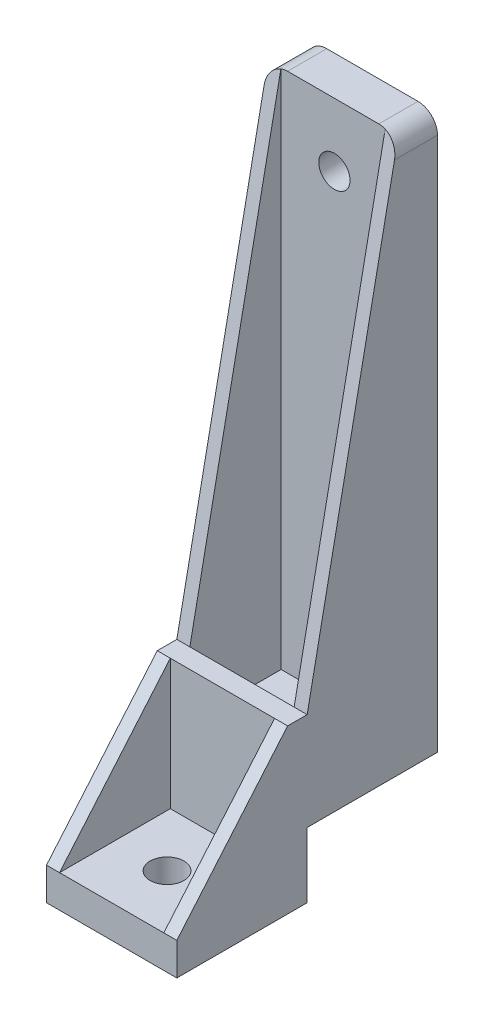
ISO-10303-21;
HEADER;
FILE_DESCRIPTION(('STEP AP214'),'2;1');
FILE_NAME('part.step','',(''),(''),'','','');
FILE_SCHEMA(('AUTOMOTIVE_DESIGN { 1 0 10303 214 1 1 1 1 }'));
ENDSEC;
DATA;
#1=APPLICATION_CONTEXT('core data for automotive mechanical design processes');
#2=APPLICATION_PROTOCOL_DEFINITION('international standard','automotive_design',2000,#1);
#3=PRODUCT_CONTEXT('',#1,'mechanical');
#4=PRODUCT('Part','Part','',(#3));
#5=PRODUCT_RELATED_PRODUCT_CATEGORY('part','',(#4));
#6=PRODUCT_DEFINITION_FORMATION('','',#4);
#7=PRODUCT_DEFINITION_CONTEXT('part definition',#1,'design');
#8=PRODUCT_DEFINITION('design','',#6,#7);
#9=PRODUCT_DEFINITION_SHAPE('','',#8);
#10=(LENGTH_UNIT() NAMED_UNIT(*) SI_UNIT(.MILLI.,.METRE.));
#11=(NAMED_UNIT(*) PLANE_ANGLE_UNIT() SI_UNIT($,.RADIAN.));
#12=(NAMED_UNIT(*) SI_UNIT($,.STERADIAN.) SOLID_ANGLE_UNIT());
#13=UNCERTAINTY_MEASURE_WITH_UNIT(LENGTH_MEASURE(1.E-05),#10,'distance_accuracy_value','');
#14=(GEOMETRIC_REPRESENTATION_CONTEXT(3) GLOBAL_UNCERTAINTY_ASSIGNED_CONTEXT((#13)) GLOBAL_UNIT_ASSIGNED_CONTEXT((#10,
#11,#12)) REPRESENTATION_CONTEXT('',''));
#15=CARTESIAN_POINT('',(0.,0.,0.));
#16=DIRECTION('',(0.,0.,1.));
#17=DIRECTION('',(1.,0.,0.));
#18=AXIS2_PLACEMENT_3D('',#15,#16,#17);
#19=CARTESIAN_POINT('',(10.,15.,-30.));
#20=DIRECTION('',(0.,-1.,0.));
#21=DIRECTION('',(0.,0.,-1.));
#22=AXIS2_PLACEMENT_3D('',#19,#20,#21);
#23=PLANE('',#22);
#24=DIRECTION('',(1.,0.,0.));
#25=VECTOR('',#24,1.);
#26=CARTESIAN_POINT('',(10.,15.,-10.));
#27=LINE('',#26,#25);
#28=CARTESIAN_POINT('',(-8.,15.,-10.));
#29=VERTEX_POINT('',#28);
#30=CARTESIAN_POINT('',(8.00000000000001,15.,-10.));
#31=VERTEX_POINT('',#30);
#32=EDGE_CURVE('E250',#29,#31,#27,.T.);
#33=ORIENTED_EDGE('',*,*,#32,.T.);
#34=DIRECTION('',(0.,0.,-1.));
#35=VECTOR('',#34,1.);
#36=CARTESIAN_POINT('',(8.00000000000001,15.,-10.));
#37=LINE('',#36,#35);
#38=CARTESIAN_POINT('',(8.00000000000001,15.,-24.));
#39=VERTEX_POINT('',#38);
#40=EDGE_CURVE('E232',#31,#39,#37,.T.);
#41=ORIENTED_EDGE('',*,*,#40,.T.);
#42=DIRECTION('',(1.,0.,0.));
#43=VECTOR('',#42,1.);
#44=CARTESIAN_POINT('',(-10.,15.,-24.));
#45=LINE('',#44,#43);
#46=CARTESIAN_POINT('',(-8.00000000000001,15.,-24.));
#47=VERTEX_POINT('',#46);
#48=EDGE_CURVE('E526',#47,#39,#45,.T.);
#49=ORIENTED_EDGE('',*,*,#48,.F.);
#50=DIRECTION('',(0.,0.,1.));
#51=VECTOR('',#50,1.);
#52=CARTESIAN_POINT('',(-8.,15.,-10.));
#53=LINE('',#52,#51);
#54=EDGE_CURVE('E258',#47,#29,#53,.T.);
#55=ORIENTED_EDGE('',*,*,#54,.T.);
#56=EDGE_LOOP('',(#33,#41,#49,#55));
#57=FACE_BOUND('',#56,.T.);
#58=ADVANCED_FACE('F53',(#57),#23,.F.);
#59=CARTESIAN_POINT('',(-10.,5.,-10.));
#60=DIRECTION('',(0.,0.,1.));
#61=DIRECTION('',(1.,0.,0.));
#62=AXIS2_PLACEMENT_3D('',#59,#60,#61);
#63=PLANE('',#62);
#64=DIRECTION('',(-1.,0.,0.));
#65=VECTOR('',#64,1.);
#66=CARTESIAN_POINT('',(70.,25.,-10.));
#67=LINE('',#66,#65);
#68=CARTESIAN_POINT('',(8.00000000000001,25.,-10.));
#69=VERTEX_POINT('',#68);
#70=CARTESIAN_POINT('',(-8.00000000000001,25.,-10.));
#71=VERTEX_POINT('',#70);
#72=EDGE_CURVE('E252',#69,#71,#67,.T.);
#73=ORIENTED_EDGE('',*,*,#72,.F.);
#74=DIRECTION('',(0.,-1.,0.));
#75=VECTOR('',#74,1.);
#76=CARTESIAN_POINT('',(8.00000000000001,25.,-10.));
#77=LINE('',#76,#75);
#78=EDGE_CURVE('E235',#69,#31,#77,.T.);
#79=ORIENTED_EDGE('',*,*,#78,.T.);
#80=ORIENTED_EDGE('',*,*,#32,.F.);
#81=DIRECTION('',(0.,1.,0.));
#82=VECTOR('',#81,1.);
#83=CARTESIAN_POINT('',(-8.,25.,-10.));
#84=LINE('',#83,#82);
#85=EDGE_CURVE('E482',#29,#71,#84,.T.);
#86=ORIENTED_EDGE('',*,*,#85,.T.);
#87=EDGE_LOOP('',(#73,#79,#80,#86));
#88=FACE_BOUND('',#87,.T.);
#89=ADVANCED_FACE('F248',(#88),#63,.F.);
#90=CARTESIAN_POINT('',(0.,0.,-24.));
#91=DIRECTION('',(0.,0.,1.));
#92=DIRECTION('',(1.,0.,0.));
#93=AXIS2_PLACEMENT_3D('',#90,#91,#92);
#94=PLANE('',#93);
#95=CARTESIAN_POINT('',(0.179346541799244,85.2824735150148,-24.));
#96=DIRECTION('',(0.,0.,1.));
#97=DIRECTION('',(1.,0.,0.));
#98=AXIS2_PLACEMENT_3D('',#95,#96,#97);
#99=CIRCLE('',#98,2.4);
#100=CARTESIAN_POINT('',(2.57934654179925,85.2824735150148,-24.));
#101=VERTEX_POINT('',#100);
#102=EDGE_CURVE('E515',#101,#101,#99,.T.);
#103=ORIENTED_EDGE('',*,*,#102,.F.);
#104=EDGE_LOOP('',(#103));
#105=FACE_BOUND('',#104,.T.);
#106=CARTESIAN_POINT('',(0.179346541799066,20.2824735150146,-24.));
#107=DIRECTION('',(0.,0.,1.));
#108=DIRECTION('',(1.,0.,0.));
#109=AXIS2_PLACEMENT_3D('',#106,#107,#108);
#110=CIRCLE('',#109,2.4);
#111=CARTESIAN_POINT('',(2.57934654179907,20.2824735150146,-24.));
#112=VERTEX_POINT('',#111);
#113=EDGE_CURVE('E519',#112,#112,#110,.T.);
#114=ORIENTED_EDGE('',*,*,#113,.F.);
#115=EDGE_LOOP('',(#114));
#116=FACE_BOUND('',#115,.T.);
#117=DIRECTION('',(-1.,0.,0.));
#118=VECTOR('',#117,1.);
#119=CARTESIAN_POINT('',(-10.,95.,-24.));
#120=LINE('',#119,#118);
#121=CARTESIAN_POINT('',(7.00000000000001,95.,-24.));
#122=VERTEX_POINT('',#121);
#123=CARTESIAN_POINT('',(-7.00000000000001,95.,-24.));
#124=VERTEX_POINT('',#123);
#125=EDGE_CURVE('E528',#122,#124,#120,.T.);
#126=ORIENTED_EDGE('',*,*,#125,.T.);
#127=CARTESIAN_POINT('',(-7.00000000000001,92.,-24.));
#128=DIRECTION('',(0.,0.,1.));
#129=DIRECTION('',(1.,0.,0.));
#130=AXIS2_PLACEMENT_3D('',#127,#128,#129);
#131=CIRCLE('',#130,3.);
#132=CARTESIAN_POINT('',(-8.00000000000001,94.8284271247462,-24.));
#133=VERTEX_POINT('',#132);
#134=EDGE_CURVE('E430',#124,#133,#131,.T.);
#135=ORIENTED_EDGE('',*,*,#134,.T.);
#136=DIRECTION('',(0.,-1.,0.));
#137=VECTOR('',#136,1.);
#138=CARTESIAN_POINT('',(-8.00000000000001,15.,-24.));
#139=LINE('',#138,#137);
#140=EDGE_CURVE('E618',#133,#47,#139,.T.);
#141=ORIENTED_EDGE('',*,*,#140,.T.);
#142=ORIENTED_EDGE('',*,*,#48,.T.);
#143=DIRECTION('',(0.,1.,0.));
#144=VECTOR('',#143,1.);
#145=CARTESIAN_POINT('',(8.00000000000001,15.,-24.));
#146=LINE('',#145,#144);
#147=CARTESIAN_POINT('',(8.00000000000001,94.8284271247462,-24.));
#148=VERTEX_POINT('',#147);
#149=EDGE_CURVE('E238',#39,#148,#146,.T.);
#150=ORIENTED_EDGE('',*,*,#149,.T.);
#151=CARTESIAN_POINT('',(7.00000000000001,92.,-24.));
#152=DIRECTION('',(0.,0.,1.));
#153=DIRECTION('',(1.,0.,0.));
#154=AXIS2_PLACEMENT_3D('',#151,#152,#153);
#155=CIRCLE('',#154,3.);
#156=EDGE_CURVE('E427',#148,#122,#155,.T.);
#157=ORIENTED_EDGE('',*,*,#156,.T.);
#158=EDGE_LOOP('',(#126,#135,#141,#142,#150,#157));
#159=FACE_BOUND('',#158,.T.);
#160=ADVANCED_FACE('F667',(#105,#116,#159),#94,.T.);
#161=DIRECTION('',(-1.,0.,0.));
#162=VECTOR('',#161,1.);
#163=CARTESIAN_POINT('',(0.,10.,-10.));
#164=LINE('',#163,#162);
#165=CARTESIAN_POINT('',(10.,10.,-10.));
#166=VERTEX_POINT('',#165);
#167=CARTESIAN_POINT('',(-10.,10.,-10.));
#168=VERTEX_POINT('',#167);
#169=EDGE_CURVE('E260',#166,#168,#164,.T.);
#170=ORIENTED_EDGE('',*,*,#169,.F.);
#171=DIRECTION('',(0.,-1.,0.));
#172=VECTOR('',#171,1.);
#173=CARTESIAN_POINT('',(10.,5.,-10.));
#174=LINE('',#173,#172);
#175=CARTESIAN_POINT('',(10.,0.,-10.));
#176=VERTEX_POINT('',#175);
#177=EDGE_CURVE('E423',#166,#176,#174,.T.);
#178=ORIENTED_EDGE('',*,*,#177,.T.);
#179=DIRECTION('',(-1.,0.,0.));
#180=VECTOR('',#179,1.);
#181=CARTESIAN_POINT('',(-10.,0.,-10.));
#182=LINE('',#181,#180);
#183=CARTESIAN_POINT('',(-10.,0.,-10.));
#184=VERTEX_POINT('',#183);
#185=EDGE_CURVE('E507',#176,#184,#182,.T.);
#186=ORIENTED_EDGE('',*,*,#185,.T.);
#187=DIRECTION('',(0.,-1.,0.));
#188=VECTOR('',#187,1.);
#189=CARTESIAN_POINT('',(-10.,5.,-10.));
#190=LINE('',#189,#188);
#191=EDGE_CURVE('E471',#168,#184,#190,.T.);
#192=ORIENTED_EDGE('',*,*,#191,.F.);
#193=EDGE_LOOP('',(#170,#178,#186,#192));
#194=FACE_BOUND('',#193,.T.);
#195=ADVANCED_FACE('F682',(#194),#63,.F.);
#196=CARTESIAN_POINT('',(0.,0.,0.));
#197=DIRECTION('',(0.,-1.,0.));
#198=DIRECTION('',(0.,0.,-1.));
#199=AXIS2_PLACEMENT_3D('',#196,#197,#198);
#200=PLANE('',#199);
#201=DIRECTION('',(-1.,0.,0.));
#202=VECTOR('',#201,1.);
#203=CARTESIAN_POINT('',(0.,0.,-5.79730094722159));
#204=LINE('',#203,#202);
#205=CARTESIAN_POINT('',(2.00000000000001,0.,-5.79730094722159));
#206=VERTEX_POINT('',#205);
#207=CARTESIAN_POINT('',(-1.99999999999999,0.,-5.79730094722159));
#208=VERTEX_POINT('',#207);
#209=EDGE_CURVE('E302',#206,#208,#204,.T.);
#210=ORIENTED_EDGE('',*,*,#209,.T.);
#211=DIRECTION('',(0.,0.,1.));
#212=VECTOR('',#211,1.);
#213=CARTESIAN_POINT('',(-1.99999999999999,0.,0.));
#214=LINE('',#213,#212);
#215=CARTESIAN_POINT('',(-1.99999999999999,0.,-2.79730094722159));
#216=VERTEX_POINT('',#215);
#217=EDGE_CURVE('E291',#208,#216,#214,.T.);
#218=ORIENTED_EDGE('',*,*,#217,.T.);
#219=DIRECTION('',(-1.,0.,0.));
#220=VECTOR('',#219,1.);
#221=CARTESIAN_POINT('',(0.,0.,-2.79730094722159));
#222=LINE('',#221,#220);
#223=CARTESIAN_POINT('',(2.00000000000001,0.,-2.79730094722159));
#224=VERTEX_POINT('',#223);
#225=EDGE_CURVE('E310',#224,#216,#222,.T.);
#226=ORIENTED_EDGE('',*,*,#225,.F.);
#227=DIRECTION('',(0.,0.,1.));
#228=VECTOR('',#227,1.);
#229=CARTESIAN_POINT('',(2.00000000000001,0.,0.));
#230=LINE('',#229,#228);
#231=EDGE_CURVE('E305',#206,#224,#230,.T.);
#232=ORIENTED_EDGE('',*,*,#231,.F.);
#233=EDGE_LOOP('',(#210,#218,#226,#232));
#234=FACE_BOUND('',#233,.T.);
#235=CARTESIAN_POINT('',(0.,0.,1.49999999999999));
#236=DIRECTION('',(0.,1.,0.));
#237=DIRECTION('',(0.,0.,1.));
#238=AXIS2_PLACEMENT_3D('',#235,#236,#237);
#239=CIRCLE('',#238,2.6);
#240=CARTESIAN_POINT('',(0.,0.,4.09999999999999));
#241=VERTEX_POINT('',#240);
#242=EDGE_CURVE('E398',#241,#241,#239,.T.);
#243=ORIENTED_EDGE('',*,*,#242,.T.);
#244=EDGE_LOOP('',(#243));
#245=FACE_BOUND('',#244,.T.);
#246=DIRECTION('',(0.,0.,-1.));
#247=VECTOR('',#246,1.);
#248=CARTESIAN_POINT('',(10.,0.,9.99999999999999));
#249=LINE('',#248,#247);
#250=CARTESIAN_POINT('',(10.,0.,9.99999999999999));
#251=VERTEX_POINT('',#250);
#252=EDGE_CURVE('E415',#251,#176,#249,.T.);
#253=ORIENTED_EDGE('',*,*,#252,.F.);
#254=DIRECTION('',(1.,0.,0.));
#255=VECTOR('',#254,1.);
#256=CARTESIAN_POINT('',(-9.99999999999999,0.,9.99999999999999));
#257=LINE('',#256,#255);
#258=CARTESIAN_POINT('',(-9.99999999999999,0.,9.99999999999999));
#259=VERTEX_POINT('',#258);
#260=EDGE_CURVE('E581',#259,#251,#257,.T.);
#261=ORIENTED_EDGE('',*,*,#260,.F.);
#262=DIRECTION('',(0.,0.,1.));
#263=VECTOR('',#262,1.);
#264=CARTESIAN_POINT('',(-9.99999999999999,0.,9.99999999999999));
#265=LINE('',#264,#263);
#266=EDGE_CURVE('E511',#184,#259,#265,.T.);
#267=ORIENTED_EDGE('',*,*,#266,.F.);
#268=ORIENTED_EDGE('',*,*,#185,.F.);
#269=EDGE_LOOP('',(#253,#261,#267,#268));
#270=FACE_BOUND('',#269,.T.);
#271=DIRECTION('',(0.,0.,-1.));
#272=VECTOR('',#271,1.);
#273=CARTESIAN_POINT('',(-1.99999999999999,0.,0.));
#274=LINE('',#273,#272);
#275=CARTESIAN_POINT('',(-1.99999999999999,0.,8.79730094722157));
#276=VERTEX_POINT('',#275);
#277=CARTESIAN_POINT('',(-1.99999999999999,0.,5.79730094722157));
#278=VERTEX_POINT('',#277);
#279=EDGE_CURVE('E352',#276,#278,#274,.T.);
#280=ORIENTED_EDGE('',*,*,#279,.F.);
#281=DIRECTION('',(-1.,0.,0.));
#282=VECTOR('',#281,1.);
#283=CARTESIAN_POINT('',(0.,0.,8.79730094722157));
#284=LINE('',#283,#282);
#285=CARTESIAN_POINT('',(2.00000000000001,0.,8.79730094722157));
#286=VERTEX_POINT('',#285);
#287=EDGE_CURVE('E285',#286,#276,#284,.T.);
#288=ORIENTED_EDGE('',*,*,#287,.F.);
#289=DIRECTION('',(0.,0.,-1.));
#290=VECTOR('',#289,1.);
#291=CARTESIAN_POINT('',(2.00000000000001,0.,0.));
#292=LINE('',#291,#290);
#293=CARTESIAN_POINT('',(2.00000000000001,0.,5.79730094722157));
#294=VERTEX_POINT('',#293);
#295=EDGE_CURVE('E337',#286,#294,#292,.T.);
#296=ORIENTED_EDGE('',*,*,#295,.T.);
#297=DIRECTION('',(-1.,0.,0.));
#298=VECTOR('',#297,1.);
#299=CARTESIAN_POINT('',(0.,0.,5.79730094722157));
#300=LINE('',#299,#298);
#301=EDGE_CURVE('E356',#294,#278,#300,.T.);
#302=ORIENTED_EDGE('',*,*,#301,.T.);
#303=EDGE_LOOP('',(#280,#288,#296,#302));
#304=FACE_BOUND('',#303,.T.);
#305=ADVANCED_FACE('F686',(#234,#245,#270,#304),#200,.T.);
#306=CARTESIAN_POINT('',(0.,5.,0.));
#307=DIRECTION('',(0.,-1.,0.));
#308=DIRECTION('',(0.,0.,-1.));
#309=AXIS2_PLACEMENT_3D('',#306,#307,#308);
#310=PLANE('',#309);
#311=CARTESIAN_POINT('',(0.,5.,1.49999999999999));
#312=DIRECTION('',(0.,-1.,0.));
#313=DIRECTION('',(0.,0.,-1.));
#314=AXIS2_PLACEMENT_3D('',#311,#312,#313);
#315=CIRCLE('',#314,2.6);
#316=CARTESIAN_POINT('',(0.,5.,-1.10000000000001));
#317=VERTEX_POINT('',#316);
#318=EDGE_CURVE('E402',#317,#317,#315,.T.);
#319=ORIENTED_EDGE('',*,*,#318,.T.);
#320=EDGE_LOOP('',(#319));
#321=FACE_BOUND('',#320,.T.);
#322=DIRECTION('',(1.,0.,0.));
#323=VECTOR('',#322,1.);
#324=CARTESIAN_POINT('',(-9.99999999999999,5.,9.99999999999999));
#325=LINE('',#324,#323);
#326=CARTESIAN_POINT('',(-8.00000000000001,5.,9.99999999999999));
#327=VERTEX_POINT('',#326);
#328=CARTESIAN_POINT('',(8.00000000000002,5.,9.99999999999999));
#329=VERTEX_POINT('',#328);
#330=EDGE_CURVE('E583',#327,#329,#325,.T.);
#331=ORIENTED_EDGE('',*,*,#330,.T.);
#332=DIRECTION('',(0.,0.,-1.));
#333=VECTOR('',#332,1.);
#334=CARTESIAN_POINT('',(8.00000000000002,5.,9.99999999999999));
#335=LINE('',#334,#333);
#336=CARTESIAN_POINT('',(8.00000000000002,5.,-7.00000000000001));
#337=VERTEX_POINT('',#336);
#338=EDGE_CURVE('E375',#329,#337,#335,.T.);
#339=ORIENTED_EDGE('',*,*,#338,.T.);
#340=DIRECTION('',(1.,0.,0.));
#341=VECTOR('',#340,1.);
#342=CARTESIAN_POINT('',(-10.,5.,-7.00000000000001));
#343=LINE('',#342,#341);
#344=CARTESIAN_POINT('',(-8.00000000000001,5.,-7.00000000000001));
#345=VERTEX_POINT('',#344);
#346=EDGE_CURVE('E406',#345,#337,#343,.T.);
#347=ORIENTED_EDGE('',*,*,#346,.F.);
#348=DIRECTION('',(0.,0.,1.));
#349=VECTOR('',#348,1.);
#350=CARTESIAN_POINT('',(-8.00000000000001,5.,9.99999999999999));
#351=LINE('',#350,#349);
#352=EDGE_CURVE('E389',#345,#327,#351,.T.);
#353=ORIENTED_EDGE('',*,*,#352,.T.);
#354=EDGE_LOOP('',(#331,#339,#347,#353));
#355=FACE_BOUND('',#354,.T.);
#356=ADVANCED_FACE('F710',(#321,#355),#310,.F.);
#357=CARTESIAN_POINT('',(-10.,25.,-7.00000000000001));
#358=DIRECTION('',(0.,0.,-1.));
#359=DIRECTION('',(-1.,0.,0.));
#360=AXIS2_PLACEMENT_3D('',#357,#358,#359);
#361=PLANE('',#360);
#362=DIRECTION('',(0.,1.,0.));
#363=VECTOR('',#362,1.);
#364=CARTESIAN_POINT('',(8.00000000000002,5.,-7.00000000000001));
#365=LINE('',#364,#363);
#366=CARTESIAN_POINT('',(8.00000000000002,25.,-7.00000000000001));
#367=VERTEX_POINT('',#366);
#368=EDGE_CURVE('E384',#337,#367,#365,.T.);
#369=ORIENTED_EDGE('',*,*,#368,.T.);
#370=DIRECTION('',(-1.,0.,0.));
#371=VECTOR('',#370,1.);
#372=CARTESIAN_POINT('',(70.,25.,-7.00000000000004));
#373=LINE('',#372,#371);
#374=CARTESIAN_POINT('',(-8.00000000000001,25.,-7.00000000000001));
#375=VERTEX_POINT('',#374);
#376=EDGE_CURVE('E564',#367,#375,#373,.T.);
#377=ORIENTED_EDGE('',*,*,#376,.T.);
#378=DIRECTION('',(0.,-1.,0.));
#379=VECTOR('',#378,1.);
#380=CARTESIAN_POINT('',(-8.00000000000001,5.,-7.00000000000001));
#381=LINE('',#380,#379);
#382=EDGE_CURVE('E394',#375,#345,#381,.T.);
#383=ORIENTED_EDGE('',*,*,#382,.T.);
#384=ORIENTED_EDGE('',*,*,#346,.T.);
#385=EDGE_LOOP('',(#369,#377,#383,#384));
#386=FACE_BOUND('',#385,.T.);
#387=ADVANCED_FACE('F720',(#386),#361,.F.);
#388=CARTESIAN_POINT('',(10.,5.,9.99999999999999));
#389=DIRECTION('',(-1.,0.,0.));
#390=DIRECTION('',(0.,0.,1.));
#391=AXIS2_PLACEMENT_3D('',#388,#389,#390);
#392=PLANE('',#391);
#393=DIRECTION('',(0.,-1.,0.));
#394=VECTOR('',#393,1.);
#395=CARTESIAN_POINT('',(10.,10.,-30.));
#396=LINE('',#395,#394);
#397=CARTESIAN_POINT('',(10.,92.,-30.));
#398=VERTEX_POINT('',#397);
#399=CARTESIAN_POINT('',(10.,10.,-30.));
#400=VERTEX_POINT('',#399);
#401=EDGE_CURVE('E274',#398,#400,#396,.T.);
#402=ORIENTED_EDGE('',*,*,#401,.F.);
#403=DIRECTION('',(0.,0.,-1.));
#404=VECTOR('',#403,1.);
#405=CARTESIAN_POINT('',(10.,92.,-24.));
#406=LINE('',#405,#404);
#407=CARTESIAN_POINT('',(10.,92.,-23.4));
#408=VERTEX_POINT('',#407);
#409=EDGE_CURVE('E76',#398,#408,#406,.F.);
#410=ORIENTED_EDGE('',*,*,#409,.T.);
#411=DIRECTION('',(0.,-0.98058067569092,0.196116135138184));
#412=VECTOR('',#411,1.);
#413=CARTESIAN_POINT('',(10.,95.,-24.));
#414=LINE('',#413,#412);
#415=CARTESIAN_POINT('',(10.,25.,-10.));
#416=VERTEX_POINT('',#415);
#417=EDGE_CURVE('E518',#408,#416,#414,.T.);
#418=ORIENTED_EDGE('',*,*,#417,.T.);
#419=DIRECTION('',(0.,0.,1.));
#420=VECTOR('',#419,1.);
#421=CARTESIAN_POINT('',(10.,25.,9.99999999999999));
#422=LINE('',#421,#420);
#423=CARTESIAN_POINT('',(10.,25.,-7.00000000000001));
#424=VERTEX_POINT('',#423);
#425=EDGE_CURVE('E271',#416,#424,#422,.T.);
#426=ORIENTED_EDGE('',*,*,#425,.T.);
#427=DIRECTION('',(0.,-0.761939317759459,0.647648420095541));
#428=VECTOR('',#427,1.);
#429=CARTESIAN_POINT('',(10.,25.,-7.00000000000001));
#430=LINE('',#429,#428);
#431=CARTESIAN_POINT('',(10.,5.,9.99999999999999));
#432=VERTEX_POINT('',#431);
#433=EDGE_CURVE('E331',#424,#432,#430,.T.);
#434=ORIENTED_EDGE('',*,*,#433,.T.);
#435=DIRECTION('',(0.,-1.,0.));
#436=VECTOR('',#435,1.);
#437=CARTESIAN_POINT('',(10.,5.,9.99999999999999));
#438=LINE('',#437,#436);
#439=EDGE_CURVE('E605',#432,#251,#438,.T.);
#440=ORIENTED_EDGE('',*,*,#439,.T.);
#441=ORIENTED_EDGE('',*,*,#252,.T.);
#442=ORIENTED_EDGE('',*,*,#177,.F.);
#443=DIRECTION('',(0.,0.,1.));
#444=VECTOR('',#443,1.);
#445=CARTESIAN_POINT('',(10.,10.,-30.));
#446=LINE('',#445,#444);
#447=EDGE_CURVE('E277',#400,#166,#446,.T.);
#448=ORIENTED_EDGE('',*,*,#447,.F.);
#449=EDGE_LOOP('',(#402,#410,#418,#426,#434,#440,#441,#442,#448));
#450=FACE_BOUND('',#449,.T.);
#451=ADVANCED_FACE('F673',(#450),#392,.F.);
#452=CARTESIAN_POINT('',(-9.99999999999999,5.,9.99999999999999));
#453=DIRECTION('',(1.,0.,0.));
#454=DIRECTION('',(0.,0.,-1.));
#455=AXIS2_PLACEMENT_3D('',#452,#453,#454);
#456=PLANE('',#455);
#457=DIRECTION('',(0.,0.98058067569092,-0.196116135138184));
#458=VECTOR('',#457,1.);
#459=CARTESIAN_POINT('',(-10.,95.,-24.));
#460=LINE('',#459,#458);
#461=CARTESIAN_POINT('',(-10.,25.,-10.));
#462=VERTEX_POINT('',#461);
#463=CARTESIAN_POINT('',(-10.,92.,-23.4));
#464=VERTEX_POINT('',#463);
#465=EDGE_CURVE('E244',#462,#464,#460,.T.);
#466=ORIENTED_EDGE('',*,*,#465,.T.);
#467=DIRECTION('',(0.,0.,1.));
#468=VECTOR('',#467,1.);
#469=CARTESIAN_POINT('',(-10.,92.,-30.));
#470=LINE('',#469,#468);
#471=CARTESIAN_POINT('',(-10.,92.,-30.));
#472=VERTEX_POINT('',#471);
#473=EDGE_CURVE('E439',#464,#472,#470,.F.);
#474=ORIENTED_EDGE('',*,*,#473,.T.);
#475=DIRECTION('',(0.,1.,0.));
#476=VECTOR('',#475,1.);
#477=CARTESIAN_POINT('',(-10.,15.,-30.));
#478=LINE('',#477,#476);
#479=CARTESIAN_POINT('',(-10.,10.,-30.));
#480=VERTEX_POINT('',#479);
#481=EDGE_CURVE('E553',#480,#472,#478,.T.);
#482=ORIENTED_EDGE('',*,*,#481,.F.);
#483=DIRECTION('',(0.,0.,1.));
#484=VECTOR('',#483,1.);
#485=CARTESIAN_POINT('',(-10.,10.,-30.));
#486=LINE('',#485,#484);
#487=EDGE_CURVE('E281',#480,#168,#486,.T.);
#488=ORIENTED_EDGE('',*,*,#487,.T.);
#489=ORIENTED_EDGE('',*,*,#191,.T.);
#490=ORIENTED_EDGE('',*,*,#266,.T.);
#491=DIRECTION('',(0.,-1.,0.));
#492=VECTOR('',#491,1.);
#493=CARTESIAN_POINT('',(-9.99999999999999,5.,9.99999999999999));
#494=LINE('',#493,#492);
#495=CARTESIAN_POINT('',(-9.99999999999999,5.,9.99999999999999));
#496=VERTEX_POINT('',#495);
#497=EDGE_CURVE('E474',#496,#259,#494,.T.);
#498=ORIENTED_EDGE('',*,*,#497,.F.);
#499=DIRECTION('',(0.,0.761939317759459,-0.647648420095541));
#500=VECTOR('',#499,1.);
#501=CARTESIAN_POINT('',(-10.,25.,-7.00000000000001));
#502=LINE('',#501,#500);
#503=CARTESIAN_POINT('',(-10.,25.,-7.00000000000001));
#504=VERTEX_POINT('',#503);
#505=EDGE_CURVE('E388',#496,#504,#502,.T.);
#506=ORIENTED_EDGE('',*,*,#505,.T.);
#507=DIRECTION('',(0.,0.,1.));
#508=VECTOR('',#507,1.);
#509=CARTESIAN_POINT('',(-10.,25.,-10.));
#510=LINE('',#509,#508);
#511=EDGE_CURVE('E557',#462,#504,#510,.T.);
#512=ORIENTED_EDGE('',*,*,#511,.F.);
#513=EDGE_LOOP('',(#466,#474,#482,#488,#489,#490,#498,#506,#512));
#514=FACE_BOUND('',#513,.T.);
#515=ADVANCED_FACE('F677',(#514),#456,.F.);
#516=CARTESIAN_POINT('',(-9.99999999999999,5.,9.99999999999999));
#517=DIRECTION('',(0.,0.,-1.));
#518=DIRECTION('',(-1.,0.,0.));
#519=AXIS2_PLACEMENT_3D('',#516,#517,#518);
#520=PLANE('',#519);
#521=ORIENTED_EDGE('',*,*,#260,.T.);
#522=ORIENTED_EDGE('',*,*,#439,.F.);
#523=DIRECTION('',(1.,0.,0.));
#524=VECTOR('',#523,1.);
#525=CARTESIAN_POINT('',(8.00000000000002,5.,9.99999999999999));
#526=LINE('',#525,#524);
#527=EDGE_CURVE('E385',#329,#432,#526,.T.);
#528=ORIENTED_EDGE('',*,*,#527,.F.);
#529=ORIENTED_EDGE('',*,*,#330,.F.);
#530=EDGE_CURVE('E603',#496,#327,#325,.T.);
#531=ORIENTED_EDGE('',*,*,#530,.F.);
#532=ORIENTED_EDGE('',*,*,#497,.T.);
#533=EDGE_LOOP('',(#521,#522,#528,#529,#531,#532));
#534=FACE_BOUND('',#533,.T.);
#535=ADVANCED_FACE('F691',(#534),#520,.F.);
#536=CARTESIAN_POINT('',(0.,0.,1.49999999999999));
#537=DIRECTION('',(0.,1.,0.));
#538=DIRECTION('',(0.,0.,1.));
#539=AXIS2_PLACEMENT_3D('',#536,#537,#538);
#540=CYLINDRICAL_SURFACE('',#539,2.6);
#541=ORIENTED_EDGE('',*,*,#242,.F.);
#542=EDGE_LOOP('',(#541));
#543=FACE_BOUND('',#542,.T.);
#544=ORIENTED_EDGE('',*,*,#318,.F.);
#545=EDGE_LOOP('',(#544));
#546=FACE_BOUND('',#545,.T.);
#547=ADVANCED_FACE('F802',(#543,#546),#540,.F.);
#548=CARTESIAN_POINT('',(-8.00000000000001,25.,-7.00000000000001));
#549=DIRECTION('',(0.,0.647648420095541,0.761939317759459));
#550=DIRECTION('',(0.,-0.761939317759459,0.647648420095541));
#551=AXIS2_PLACEMENT_3D('',#548,#549,#550);
#552=PLANE('',#551);
#553=ORIENTED_EDGE('',*,*,#505,.F.);
#554=ORIENTED_EDGE('',*,*,#530,.T.);
#555=DIRECTION('',(0.,0.761939317759459,-0.647648420095541));
#556=VECTOR('',#555,1.);
#557=CARTESIAN_POINT('',(-8.00000000000001,25.,-7.00000000000001));
#558=LINE('',#557,#556);
#559=EDGE_CURVE('E393',#327,#375,#558,.T.);
#560=ORIENTED_EDGE('',*,*,#559,.T.);
#561=DIRECTION('',(1.,0.,0.));
#562=VECTOR('',#561,1.);
#563=CARTESIAN_POINT('',(-10.,25.,-7.00000000000001));
#564=LINE('',#563,#562);
#565=EDGE_CURVE('E411',#504,#375,#564,.T.);
#566=ORIENTED_EDGE('',*,*,#565,.F.);
#567=EDGE_LOOP('',(#553,#554,#560,#566));
#568=FACE_BOUND('',#567,.T.);
#569=ADVANCED_FACE('F727',(#568),#552,.T.);
#570=CARTESIAN_POINT('',(-8.00000000000001,0.,0.));
#571=DIRECTION('',(-1.,0.,0.));
#572=DIRECTION('',(0.,0.,1.));
#573=AXIS2_PLACEMENT_3D('',#570,#571,#572);
#574=PLANE('',#573);
#575=ORIENTED_EDGE('',*,*,#382,.F.);
#576=ORIENTED_EDGE('',*,*,#559,.F.);
#577=ORIENTED_EDGE('',*,*,#352,.F.);
#578=EDGE_LOOP('',(#575,#576,#577));
#579=FACE_BOUND('',#578,.T.);
#580=ADVANCED_FACE('F724',(#579),#574,.F.);
#581=CARTESIAN_POINT('',(8.00000000000002,25.,-7.00000000000001));
#582=DIRECTION('',(0.,0.647648420095541,0.761939317759459));
#583=DIRECTION('',(0.,-0.761939317759459,0.647648420095541));
#584=AXIS2_PLACEMENT_3D('',#581,#582,#583);
#585=PLANE('',#584);
#586=ORIENTED_EDGE('',*,*,#433,.F.);
#587=DIRECTION('',(1.,0.,0.));
#588=VECTOR('',#587,1.);
#589=CARTESIAN_POINT('',(8.00000000000002,25.,-7.00000000000001));
#590=LINE('',#589,#588);
#591=EDGE_CURVE('E379',#367,#424,#590,.T.);
#592=ORIENTED_EDGE('',*,*,#591,.F.);
#593=DIRECTION('',(0.,-0.761939317759459,0.647648420095541));
#594=VECTOR('',#593,1.);
#595=CARTESIAN_POINT('',(8.00000000000002,25.,-7.00000000000001));
#596=LINE('',#595,#594);
#597=EDGE_CURVE('E380',#367,#329,#596,.T.);
#598=ORIENTED_EDGE('',*,*,#597,.T.);
#599=ORIENTED_EDGE('',*,*,#527,.T.);
#600=EDGE_LOOP('',(#586,#592,#598,#599));
#601=FACE_BOUND('',#600,.T.);
#602=ADVANCED_FACE('F714',(#601),#585,.T.);
#603=CARTESIAN_POINT('',(8.00000000000002,0.,0.));
#604=DIRECTION('',(-1.,0.,0.));
#605=DIRECTION('',(0.,0.,1.));
#606=AXIS2_PLACEMENT_3D('',#603,#604,#605);
#607=PLANE('',#606);
#608=ORIENTED_EDGE('',*,*,#368,.F.);
#609=ORIENTED_EDGE('',*,*,#338,.F.);
#610=ORIENTED_EDGE('',*,*,#597,.F.);
#611=EDGE_LOOP('',(#608,#609,#610));
#612=FACE_BOUND('',#611,.T.);
#613=ADVANCED_FACE('F718',(#612),#607,.T.);
#614=CARTESIAN_POINT('',(0.,-0.8,8.79730094722157));
#615=DIRECTION('',(0.,0.,-1.));
#616=DIRECTION('',(-1.,0.,0.));
#617=AXIS2_PLACEMENT_3D('',#614,#615,#616);
#618=PLANE('',#617);
#619=ORIENTED_EDGE('',*,*,#287,.T.);
#620=DIRECTION('',(0.,1.,0.));
#621=VECTOR('',#620,1.);
#622=CARTESIAN_POINT('',(-1.99999999999999,-0.8,8.79730094722157));
#623=LINE('',#622,#621);
#624=CARTESIAN_POINT('',(-1.99999999999999,-0.8,8.79730094722157));
#625=VERTEX_POINT('',#624);
#626=EDGE_CURVE('E306',#625,#276,#623,.T.);
#627=ORIENTED_EDGE('',*,*,#626,.F.);
#628=DIRECTION('',(-1.,0.,0.));
#629=VECTOR('',#628,1.);
#630=CARTESIAN_POINT('',(0.,-0.8,8.79730094722157));
#631=LINE('',#630,#629);
#632=CARTESIAN_POINT('',(2.00000000000001,-0.8,8.79730094722157));
#633=VERTEX_POINT('',#632);
#634=EDGE_CURVE('E332',#633,#625,#631,.T.);
#635=ORIENTED_EDGE('',*,*,#634,.F.);
#636=DIRECTION('',(0.,1.,0.));
#637=VECTOR('',#636,1.);
#638=CARTESIAN_POINT('',(2.00000000000001,-0.8,8.79730094722157));
#639=LINE('',#638,#637);
#640=EDGE_CURVE('E348',#633,#286,#639,.T.);
#641=ORIENTED_EDGE('',*,*,#640,.T.);
#642=EDGE_LOOP('',(#619,#627,#635,#641));
#643=FACE_BOUND('',#642,.T.);
#644=ADVANCED_FACE('F789',(#643),#618,.F.);
#645=CARTESIAN_POINT('',(-1.99999999999999,-0.8,0.));
#646=DIRECTION('',(1.,0.,0.));
#647=DIRECTION('',(0.,0.,-1.));
#648=AXIS2_PLACEMENT_3D('',#645,#646,#647);
#649=PLANE('',#648);
#650=ORIENTED_EDGE('',*,*,#279,.T.);
#651=DIRECTION('',(0.,1.,0.));
#652=VECTOR('',#651,1.);
#653=CARTESIAN_POINT('',(-1.99999999999999,-0.8,5.79730094722157));
#654=LINE('',#653,#652);
#655=CARTESIAN_POINT('',(-1.99999999999999,-0.8,5.79730094722157));
#656=VERTEX_POINT('',#655);
#657=EDGE_CURVE('E368',#656,#278,#654,.T.);
#658=ORIENTED_EDGE('',*,*,#657,.F.);
#659=DIRECTION('',(0.,0.,-1.));
#660=VECTOR('',#659,1.);
#661=CARTESIAN_POINT('',(-1.99999999999999,-0.8,0.));
#662=LINE('',#661,#660);
#663=EDGE_CURVE('E336',#625,#656,#662,.T.);
#664=ORIENTED_EDGE('',*,*,#663,.F.);
#665=ORIENTED_EDGE('',*,*,#626,.T.);
#666=EDGE_LOOP('',(#650,#658,#664,#665));
#667=FACE_BOUND('',#666,.T.);
#668=ADVANCED_FACE('F785',(#667),#649,.F.);
#669=CARTESIAN_POINT('',(0.,-0.8,5.79730094722157));
#670=DIRECTION('',(0.,0.,-1.));
#671=DIRECTION('',(-1.,0.,0.));
#672=AXIS2_PLACEMENT_3D('',#669,#670,#671);
#673=PLANE('',#672);
#674=ORIENTED_EDGE('',*,*,#301,.F.);
#675=DIRECTION('',(0.,1.,0.));
#676=VECTOR('',#675,1.);
#677=CARTESIAN_POINT('',(2.00000000000001,-0.8,5.79730094722157));
#678=LINE('',#677,#676);
#679=CARTESIAN_POINT('',(2.00000000000001,-0.8,5.79730094722157));
#680=VERTEX_POINT('',#679);
#681=EDGE_CURVE('E364',#680,#294,#678,.T.);
#682=ORIENTED_EDGE('',*,*,#681,.F.);
#683=DIRECTION('',(-1.,0.,0.));
#684=VECTOR('',#683,1.);
#685=CARTESIAN_POINT('',(0.,-0.8,5.79730094722157));
#686=LINE('',#685,#684);
#687=EDGE_CURVE('E340',#680,#656,#686,.T.);
#688=ORIENTED_EDGE('',*,*,#687,.T.);
#689=ORIENTED_EDGE('',*,*,#657,.T.);
#690=EDGE_LOOP('',(#674,#682,#688,#689));
#691=FACE_BOUND('',#690,.T.);
#692=ADVANCED_FACE('F781',(#691),#673,.T.);
#693=CARTESIAN_POINT('',(2.00000000000001,-0.8,0.));
#694=DIRECTION('',(1.,0.,0.));
#695=DIRECTION('',(0.,0.,-1.));
#696=AXIS2_PLACEMENT_3D('',#693,#694,#695);
#697=PLANE('',#696);
#698=ORIENTED_EDGE('',*,*,#295,.F.);
#699=ORIENTED_EDGE('',*,*,#640,.F.);
#700=DIRECTION('',(0.,0.,-1.));
#701=VECTOR('',#700,1.);
#702=CARTESIAN_POINT('',(2.00000000000001,-0.8,0.));
#703=LINE('',#702,#701);
#704=EDGE_CURVE('E344',#633,#680,#703,.T.);
#705=ORIENTED_EDGE('',*,*,#704,.T.);
#706=ORIENTED_EDGE('',*,*,#681,.T.);
#707=EDGE_LOOP('',(#698,#699,#705,#706));
#708=FACE_BOUND('',#707,.T.);
#709=ADVANCED_FACE('F777',(#708),#697,.T.);
#710=CARTESIAN_POINT('',(0.,-0.8,0.));
#711=DIRECTION('',(0.,-1.,0.));
#712=DIRECTION('',(0.,0.,-1.));
#713=AXIS2_PLACEMENT_3D('',#710,#711,#712);
#714=PLANE('',#713);
#715=ORIENTED_EDGE('',*,*,#634,.T.);
#716=ORIENTED_EDGE('',*,*,#663,.T.);
#717=ORIENTED_EDGE('',*,*,#687,.F.);
#718=ORIENTED_EDGE('',*,*,#704,.F.);
#719=EDGE_LOOP('',(#715,#716,#717,#718));
#720=FACE_BOUND('',#719,.T.);
#721=ADVANCED_FACE('F773',(#720),#714,.T.);
#722=CARTESIAN_POINT('',(0.,-0.8,-5.79730094722159));
#723=DIRECTION('',(0.,0.,-1.));
#724=DIRECTION('',(-1.,0.,0.));
#725=AXIS2_PLACEMENT_3D('',#722,#723,#724);
#726=PLANE('',#725);
#727=ORIENTED_EDGE('',*,*,#209,.F.);
#728=DIRECTION('',(0.,1.,0.));
#729=VECTOR('',#728,1.);
#730=CARTESIAN_POINT('',(2.00000000000001,-0.8,-5.79730094722159));
#731=LINE('',#730,#729);
#732=CARTESIAN_POINT('',(2.00000000000001,-0.8,-5.79730094722159));
#733=VERTEX_POINT('',#732);
#734=EDGE_CURVE('E327',#733,#206,#731,.T.);
#735=ORIENTED_EDGE('',*,*,#734,.F.);
#736=DIRECTION('',(-1.,0.,0.));
#737=VECTOR('',#736,1.);
#738=CARTESIAN_POINT('',(0.,-0.8,-5.79730094722159));
#739=LINE('',#738,#737);
#740=CARTESIAN_POINT('',(-1.99999999999999,-0.8,-5.79730094722159));
#741=VERTEX_POINT('',#740);
#742=EDGE_CURVE('E286',#733,#741,#739,.T.);
#743=ORIENTED_EDGE('',*,*,#742,.T.);
#744=DIRECTION('',(0.,1.,0.));
#745=VECTOR('',#744,1.);
#746=CARTESIAN_POINT('',(-1.99999999999999,-0.8,-5.79730094722159));
#747=LINE('',#746,#745);
#748=EDGE_CURVE('E301',#741,#208,#747,.T.);
#749=ORIENTED_EDGE('',*,*,#748,.T.);
#750=EDGE_LOOP('',(#727,#735,#743,#749));
#751=FACE_BOUND('',#750,.T.);
#752=ADVANCED_FACE('F769',(#751),#726,.T.);
#753=CARTESIAN_POINT('',(2.00000000000001,-0.8,0.));
#754=DIRECTION('',(-1.,0.,0.));
#755=DIRECTION('',(0.,0.,1.));
#756=AXIS2_PLACEMENT_3D('',#753,#754,#755);
#757=PLANE('',#756);
#758=ORIENTED_EDGE('',*,*,#231,.T.);
#759=DIRECTION('',(0.,1.,0.));
#760=VECTOR('',#759,1.);
#761=CARTESIAN_POINT('',(2.00000000000001,-0.8,-2.79730094722159));
#762=LINE('',#761,#760);
#763=CARTESIAN_POINT('',(2.00000000000001,-0.8,-2.79730094722159));
#764=VERTEX_POINT('',#763);
#765=EDGE_CURVE('E323',#764,#224,#762,.T.);
#766=ORIENTED_EDGE('',*,*,#765,.F.);
#767=DIRECTION('',(0.,0.,1.));
#768=VECTOR('',#767,1.);
#769=CARTESIAN_POINT('',(2.00000000000001,-0.8,0.));
#770=LINE('',#769,#768);
#771=EDGE_CURVE('E290',#733,#764,#770,.T.);
#772=ORIENTED_EDGE('',*,*,#771,.F.);
#773=ORIENTED_EDGE('',*,*,#734,.T.);
#774=EDGE_LOOP('',(#758,#766,#772,#773));
#775=FACE_BOUND('',#774,.T.);
#776=ADVANCED_FACE('F765',(#775),#757,.F.);
#777=CARTESIAN_POINT('',(0.,-0.8,-2.79730094722159));
#778=DIRECTION('',(0.,0.,-1.));
#779=DIRECTION('',(-1.,0.,0.));
#780=AXIS2_PLACEMENT_3D('',#777,#778,#779);
#781=PLANE('',#780);
#782=ORIENTED_EDGE('',*,*,#225,.T.);
#783=DIRECTION('',(0.,1.,0.));
#784=VECTOR('',#783,1.);
#785=CARTESIAN_POINT('',(-1.99999999999999,-0.8,-2.79730094722159));
#786=LINE('',#785,#784);
#787=CARTESIAN_POINT('',(-1.99999999999999,-0.8,-2.79730094722159));
#788=VERTEX_POINT('',#787);
#789=EDGE_CURVE('E319',#788,#216,#786,.T.);
#790=ORIENTED_EDGE('',*,*,#789,.F.);
#791=DIRECTION('',(-1.,0.,0.));
#792=VECTOR('',#791,1.);
#793=CARTESIAN_POINT('',(0.,-0.8,-2.79730094722159));
#794=LINE('',#793,#792);
#795=EDGE_CURVE('E294',#764,#788,#794,.T.);
#796=ORIENTED_EDGE('',*,*,#795,.F.);
#797=ORIENTED_EDGE('',*,*,#765,.T.);
#798=EDGE_LOOP('',(#782,#790,#796,#797));
#799=FACE_BOUND('',#798,.T.);
#800=ADVANCED_FACE('F761',(#799),#781,.F.);
#801=CARTESIAN_POINT('',(-1.99999999999999,-0.8,0.));
#802=DIRECTION('',(-1.,0.,0.));
#803=DIRECTION('',(0.,0.,1.));
#804=AXIS2_PLACEMENT_3D('',#801,#802,#803);
#805=PLANE('',#804);
#806=ORIENTED_EDGE('',*,*,#217,.F.);
#807=ORIENTED_EDGE('',*,*,#748,.F.);
#808=DIRECTION('',(0.,0.,1.));
#809=VECTOR('',#808,1.);
#810=CARTESIAN_POINT('',(-1.99999999999999,-0.8,0.));
#811=LINE('',#810,#809);
#812=EDGE_CURVE('E297',#741,#788,#811,.T.);
#813=ORIENTED_EDGE('',*,*,#812,.T.);
#814=ORIENTED_EDGE('',*,*,#789,.T.);
#815=EDGE_LOOP('',(#806,#807,#813,#814));
#816=FACE_BOUND('',#815,.T.);
#817=ADVANCED_FACE('F757',(#816),#805,.T.);
#818=CARTESIAN_POINT('',(0.,-0.8,0.));
#819=DIRECTION('',(0.,-1.,0.));
#820=DIRECTION('',(0.,0.,-1.));
#821=AXIS2_PLACEMENT_3D('',#818,#819,#820);
#822=PLANE('',#821);
#823=ORIENTED_EDGE('',*,*,#742,.F.);
#824=ORIENTED_EDGE('',*,*,#771,.T.);
#825=ORIENTED_EDGE('',*,*,#795,.T.);
#826=ORIENTED_EDGE('',*,*,#812,.F.);
#827=EDGE_LOOP('',(#823,#824,#825,#826));
#828=FACE_BOUND('',#827,.T.);
#829=ADVANCED_FACE('F754',(#828),#822,.T.);
#830=CARTESIAN_POINT('',(0.,10.,-30.));
#831=DIRECTION('',(0.,1.,0.));
#832=DIRECTION('',(-1.,0.,0.));
#833=AXIS2_PLACEMENT_3D('',#830,#831,#832);
#834=PLANE('',#833);
#835=ORIENTED_EDGE('',*,*,#169,.T.);
#836=ORIENTED_EDGE('',*,*,#487,.F.);
#837=DIRECTION('',(-1.,0.,0.));
#838=VECTOR('',#837,1.);
#839=CARTESIAN_POINT('',(-10.,10.,-30.));
#840=LINE('',#839,#838);
#841=EDGE_CURVE('E267',#400,#480,#840,.T.);
#842=ORIENTED_EDGE('',*,*,#841,.F.);
#843=ORIENTED_EDGE('',*,*,#447,.T.);
#844=EDGE_LOOP('',(#835,#836,#842,#843));
#845=FACE_BOUND('',#844,.T.);
#846=ADVANCED_FACE('F676',(#845),#834,.F.);
#847=CARTESIAN_POINT('',(0.,0.,-30.));
#848=DIRECTION('',(0.,0.,1.));
#849=DIRECTION('',(1.,0.,0.));
#850=AXIS2_PLACEMENT_3D('',#847,#848,#849);
#851=PLANE('',#850);
#852=CARTESIAN_POINT('',(0.179346541799244,85.2824735150148,-30.));
#853=DIRECTION('',(0.,0.,-1.));
#854=DIRECTION('',(-1.,0.,0.));
#855=AXIS2_PLACEMENT_3D('',#852,#853,#854);
#856=CIRCLE('',#855,2.4);
#857=CARTESIAN_POINT('',(-2.22065345820076,85.2824735150148,-30.));
#858=VERTEX_POINT('',#857);
#859=EDGE_CURVE('E610',#858,#858,#856,.T.);
#860=ORIENTED_EDGE('',*,*,#859,.F.);
#861=EDGE_LOOP('',(#860));
#862=FACE_BOUND('',#861,.T.);
#863=CARTESIAN_POINT('',(0.179346541799066,20.2824735150146,-30.));
#864=DIRECTION('',(0.,0.,-1.));
#865=DIRECTION('',(-1.,0.,0.));
#866=AXIS2_PLACEMENT_3D('',#863,#864,#865);
#867=CIRCLE('',#866,2.4);
#868=CARTESIAN_POINT('',(-2.22065345820093,20.2824735150146,-30.));
#869=VERTEX_POINT('',#868);
#870=EDGE_CURVE('E613',#869,#869,#867,.T.);
#871=ORIENTED_EDGE('',*,*,#870,.F.);
#872=EDGE_LOOP('',(#871));
#873=FACE_BOUND('',#872,.T.);
#874=ORIENTED_EDGE('',*,*,#481,.T.);
#875=CARTESIAN_POINT('',(-7.00000000000001,92.,-30.));
#876=DIRECTION('',(0.,0.,1.));
#877=DIRECTION('',(1.,0.,0.));
#878=AXIS2_PLACEMENT_3D('',#875,#876,#877);
#879=CIRCLE('',#878,3.);
#880=CARTESIAN_POINT('',(-7.00000000000001,95.,-30.));
#881=VERTEX_POINT('',#880);
#882=EDGE_CURVE('E445',#472,#881,#879,.F.);
#883=ORIENTED_EDGE('',*,*,#882,.T.);
#884=DIRECTION('',(-1.,0.,0.));
#885=VECTOR('',#884,1.);
#886=CARTESIAN_POINT('',(-10.,95.,-30.));
#887=LINE('',#886,#885);
#888=CARTESIAN_POINT('',(7.00000000000001,95.,-30.));
#889=VERTEX_POINT('',#888);
#890=EDGE_CURVE('E261',#889,#881,#887,.T.);
#891=ORIENTED_EDGE('',*,*,#890,.F.);
#892=CARTESIAN_POINT('',(7.00000000000001,92.,-30.));
#893=DIRECTION('',(0.,0.,1.));
#894=DIRECTION('',(1.,0.,0.));
#895=AXIS2_PLACEMENT_3D('',#892,#893,#894);
#896=CIRCLE('',#895,3.);
#897=EDGE_CURVE('E442',#889,#398,#896,.F.);
#898=ORIENTED_EDGE('',*,*,#897,.T.);
#899=ORIENTED_EDGE('',*,*,#401,.T.);
#900=ORIENTED_EDGE('',*,*,#841,.T.);
#901=EDGE_LOOP('',(#874,#883,#891,#898,#899,#900));
#902=FACE_BOUND('',#901,.T.);
#903=ADVANCED_FACE('F651',(#862,#873,#902),#851,.F.);
#904=CARTESIAN_POINT('',(0.,95.,0.));
#905=DIRECTION('',(0.,1.,0.));
#906=DIRECTION('',(0.,0.,1.));
#907=AXIS2_PLACEMENT_3D('',#904,#905,#906);
#908=PLANE('',#907);
#909=ORIENTED_EDGE('',*,*,#890,.T.);
#910=DIRECTION('',(0.,0.,1.));
#911=VECTOR('',#910,1.);
#912=CARTESIAN_POINT('',(-7.00000000000001,95.,-24.));
#913=LINE('',#912,#911);
#914=EDGE_CURVE('E422',#881,#124,#913,.T.);
#915=ORIENTED_EDGE('',*,*,#914,.T.);
#916=ORIENTED_EDGE('',*,*,#125,.F.);
#917=DIRECTION('',(0.,0.,-1.));
#918=VECTOR('',#917,1.);
#919=CARTESIAN_POINT('',(7.00000000000001,95.,-30.));
#920=LINE('',#919,#918);
#921=EDGE_CURVE('E418',#122,#889,#920,.T.);
#922=ORIENTED_EDGE('',*,*,#921,.T.);
#923=EDGE_LOOP('',(#909,#915,#916,#922));
#924=FACE_BOUND('',#923,.T.);
#925=ADVANCED_FACE('F664',(#924),#908,.T.);
#926=CARTESIAN_POINT('',(70.,25.,-10.));
#927=DIRECTION('',(0.,-1.,0.));
#928=DIRECTION('',(0.,0.,-1.));
#929=AXIS2_PLACEMENT_3D('',#926,#927,#928);
#930=PLANE('',#929);
#931=EDGE_CURVE('E567',#416,#69,#67,.T.);
#932=ORIENTED_EDGE('',*,*,#931,.T.);
#933=ORIENTED_EDGE('',*,*,#72,.T.);
#934=DIRECTION('',(-1.,0.,0.));
#935=VECTOR('',#934,1.);
#936=CARTESIAN_POINT('',(-8.,25.,-10.));
#937=LINE('',#936,#935);
#938=EDGE_CURVE('E481',#71,#462,#937,.T.);
#939=ORIENTED_EDGE('',*,*,#938,.T.);
#940=ORIENTED_EDGE('',*,*,#511,.T.);
#941=ORIENTED_EDGE('',*,*,#565,.T.);
#942=ORIENTED_EDGE('',*,*,#376,.F.);
#943=ORIENTED_EDGE('',*,*,#591,.T.);
#944=ORIENTED_EDGE('',*,*,#425,.F.);
#945=EDGE_LOOP('',(#932,#933,#939,#940,#941,#942,#943,#944));
#946=FACE_BOUND('',#945,.T.);
#947=ADVANCED_FACE('F744',(#946),#930,.F.);
#948=CARTESIAN_POINT('',(-8.00000000000001,95.,-24.));
#949=DIRECTION('',(0.,0.196116135138184,0.98058067569092));
#950=DIRECTION('',(0.,-0.98058067569092,0.196116135138184));
#951=AXIS2_PLACEMENT_3D('',#948,#949,#950);
#952=PLANE('',#951);
#953=DIRECTION('',(0.,0.98058067569092,-0.196116135138184));
#954=VECTOR('',#953,1.);
#955=CARTESIAN_POINT('',(-8.00000000000001,95.,-24.));
#956=LINE('',#955,#954);
#957=CARTESIAN_POINT('',(-8.00000000000001,94.8284271247462,-23.9656854249492));
#958=VERTEX_POINT('',#957);
#959=EDGE_CURVE('E478',#71,#958,#956,.T.);
#960=ORIENTED_EDGE('',*,*,#959,.T.);
#961=CARTESIAN_POINT('',(-7.00000000000001,92.,-23.4));
#962=DIRECTION('',(0.,0.196116135138184,0.98058067569092));
#963=DIRECTION('',(0.,0.98058067569092,-0.196116135138184));
#964=AXIS2_PLACEMENT_3D('',#961,#962,#963);
#965=ELLIPSE('',#964,3.05941170815567,3.);
#966=EDGE_CURVE('E436',#958,#464,#965,.T.);
#967=ORIENTED_EDGE('',*,*,#966,.T.);
#968=ORIENTED_EDGE('',*,*,#465,.F.);
#969=ORIENTED_EDGE('',*,*,#938,.F.);
#970=EDGE_LOOP('',(#960,#967,#968,#969));
#971=FACE_BOUND('',#970,.T.);
#972=ADVANCED_FACE('F733',(#971),#952,.T.);
#973=CARTESIAN_POINT('',(-8.,0.,0.));
#974=DIRECTION('',(-1.,0.,0.));
#975=DIRECTION('',(0.,0.,1.));
#976=AXIS2_PLACEMENT_3D('',#973,#974,#975);
#977=PLANE('',#976);
#978=ORIENTED_EDGE('',*,*,#140,.F.);
#979=DIRECTION('',(0.,0.,-1.));
#980=VECTOR('',#979,1.);
#981=CARTESIAN_POINT('',(-8.00000000000001,94.8284271247462,-24.));
#982=LINE('',#981,#980);
#983=EDGE_CURVE('E433',#133,#958,#982,.F.);
#984=ORIENTED_EDGE('',*,*,#983,.T.);
#985=ORIENTED_EDGE('',*,*,#959,.F.);
#986=ORIENTED_EDGE('',*,*,#85,.F.);
#987=ORIENTED_EDGE('',*,*,#54,.F.);
#988=EDGE_LOOP('',(#978,#984,#985,#986,#987));
#989=FACE_BOUND('',#988,.T.);
#990=ADVANCED_FACE('F736',(#989),#977,.F.);
#991=CARTESIAN_POINT('',(8.00000000000001,95.,-24.));
#992=DIRECTION('',(0.,0.196116135138184,0.98058067569092));
#993=DIRECTION('',(0.,-0.98058067569092,0.196116135138184));
#994=AXIS2_PLACEMENT_3D('',#991,#992,#993);
#995=PLANE('',#994);
#996=ORIENTED_EDGE('',*,*,#417,.F.);
#997=CARTESIAN_POINT('',(7.00000000000001,92.,-23.4));
#998=DIRECTION('',(0.,0.196116135138184,0.98058067569092));
#999=DIRECTION('',(0.,-0.98058067569092,0.196116135138184));
#1000=AXIS2_PLACEMENT_3D('',#997,#998,#999);
#1001=ELLIPSE('',#1000,3.05941170815567,3.);
#1002=CARTESIAN_POINT('',(8.00000000000001,94.8284271247462,-23.9656854249492));
#1003=VERTEX_POINT('',#1002);
#1004=EDGE_CURVE('E62',#408,#1003,#1001,.T.);
#1005=ORIENTED_EDGE('',*,*,#1004,.T.);
#1006=DIRECTION('',(0.,-0.98058067569092,0.196116135138184));
#1007=VECTOR('',#1006,1.);
#1008=CARTESIAN_POINT('',(8.00000000000001,95.,-24.));
#1009=LINE('',#1008,#1007);
#1010=EDGE_CURVE('E255',#1003,#69,#1009,.T.);
#1011=ORIENTED_EDGE('',*,*,#1010,.T.);
#1012=ORIENTED_EDGE('',*,*,#931,.F.);
#1013=EDGE_LOOP('',(#996,#1005,#1011,#1012));
#1014=FACE_BOUND('',#1013,.T.);
#1015=ADVANCED_FACE('F738',(#1014),#995,.T.);
#1016=CARTESIAN_POINT('',(8.00000000000001,0.,0.));
#1017=DIRECTION('',(-1.,0.,0.));
#1018=DIRECTION('',(0.,0.,1.));
#1019=AXIS2_PLACEMENT_3D('',#1016,#1017,#1018);
#1020=PLANE('',#1019);
#1021=ORIENTED_EDGE('',*,*,#1010,.F.);
#1022=DIRECTION('',(0.,0.,1.));
#1023=VECTOR('',#1022,1.);
#1024=CARTESIAN_POINT('',(8.00000000000001,94.8284271247462,-23.9656854249492));
#1025=LINE('',#1024,#1023);
#1026=EDGE_CURVE('E11',#1003,#148,#1025,.F.);
#1027=ORIENTED_EDGE('',*,*,#1026,.T.);
#1028=ORIENTED_EDGE('',*,*,#149,.F.);
#1029=ORIENTED_EDGE('',*,*,#40,.F.);
#1030=ORIENTED_EDGE('',*,*,#78,.F.);
#1031=EDGE_LOOP('',(#1021,#1027,#1028,#1029,#1030));
#1032=FACE_BOUND('',#1031,.T.);
#1033=ADVANCED_FACE('F234',(#1032),#1020,.T.);
#1034=CARTESIAN_POINT('',(-7.,92.,0.));
#1035=DIRECTION('',(0.,0.,-1.));
#1036=DIRECTION('',(-1.,0.,0.));
#1037=AXIS2_PLACEMENT_3D('',#1034,#1035,#1036);
#1038=CYLINDRICAL_SURFACE('',#1037,3.);
#1039=ORIENTED_EDGE('',*,*,#882,.F.);
#1040=ORIENTED_EDGE('',*,*,#473,.F.);
#1041=ORIENTED_EDGE('',*,*,#966,.F.);
#1042=ORIENTED_EDGE('',*,*,#983,.F.);
#1043=ORIENTED_EDGE('',*,*,#134,.F.);
#1044=ORIENTED_EDGE('',*,*,#914,.F.);
#1045=EDGE_LOOP('',(#1039,#1040,#1041,#1042,#1043,#1044));
#1046=FACE_BOUND('',#1045,.T.);
#1047=ADVANCED_FACE('F659',(#1046),#1038,.T.);
#1048=CARTESIAN_POINT('',(7.00000000000001,92.,0.));
#1049=DIRECTION('',(0.,0.,1.));
#1050=DIRECTION('',(1.,0.,0.));
#1051=AXIS2_PLACEMENT_3D('',#1048,#1049,#1050);
#1052=CYLINDRICAL_SURFACE('',#1051,3.);
#1053=ORIENTED_EDGE('',*,*,#1004,.F.);
#1054=ORIENTED_EDGE('',*,*,#409,.F.);
#1055=ORIENTED_EDGE('',*,*,#897,.F.);
#1056=ORIENTED_EDGE('',*,*,#921,.F.);
#1057=ORIENTED_EDGE('',*,*,#156,.F.);
#1058=ORIENTED_EDGE('',*,*,#1026,.F.);
#1059=EDGE_LOOP('',(#1053,#1054,#1055,#1056,#1057,#1058));
#1060=FACE_BOUND('',#1059,.T.);
#1061=ADVANCED_FACE('F55',(#1060),#1052,.T.);
#1062=CARTESIAN_POINT('',(0.179346541799066,20.2824735150146,-21.));
#1063=DIRECTION('',(0.,0.,-1.));
#1064=DIRECTION('',(-1.,0.,0.));
#1065=AXIS2_PLACEMENT_3D('',#1062,#1063,#1064);
#1066=CYLINDRICAL_SURFACE('',#1065,2.4);
#1067=ORIENTED_EDGE('',*,*,#113,.T.);
#1068=EDGE_LOOP('',(#1067));
#1069=FACE_BOUND('',#1068,.T.);
#1070=ORIENTED_EDGE('',*,*,#870,.T.);
#1071=EDGE_LOOP('',(#1070));
#1072=FACE_BOUND('',#1071,.T.);
#1073=ADVANCED_FACE('F824',(#1069,#1072),#1066,.F.);
#1074=CARTESIAN_POINT('',(0.179346541799244,85.2824735150148,-21.));
#1075=DIRECTION('',(0.,0.,-1.));
#1076=DIRECTION('',(-1.,0.,0.));
#1077=AXIS2_PLACEMENT_3D('',#1074,#1075,#1076);
#1078=CYLINDRICAL_SURFACE('',#1077,2.4);
#1079=ORIENTED_EDGE('',*,*,#102,.T.);
#1080=EDGE_LOOP('',(#1079));
#1081=FACE_BOUND('',#1080,.T.);
#1082=ORIENTED_EDGE('',*,*,#859,.T.);
#1083=EDGE_LOOP('',(#1082));
#1084=FACE_BOUND('',#1083,.T.);
#1085=ADVANCED_FACE('F830',(#1081,#1084),#1078,.F.);
#1086=CLOSED_SHELL('',(#58,#89,#160,#195,#305,#356,#387,#451,#515,#535,#547,#569,#580,#602,#613,
#644,#668,#692,#709,#721,#752,#776,#800,#817,#829,#846,#903,#925,#947,#972,#990,#1015,#1033,
#1047,#1061,#1073,#1085));
#1087=MANIFOLD_SOLID_BREP('B2',#1086);
#1088=ADVANCED_BREP_SHAPE_REPRESENTATION('',(#18,#1087),#14);
#1089=SHAPE_DEFINITION_REPRESENTATION(#9,#1088);
ENDSEC;
END-ISO-10303-21;
